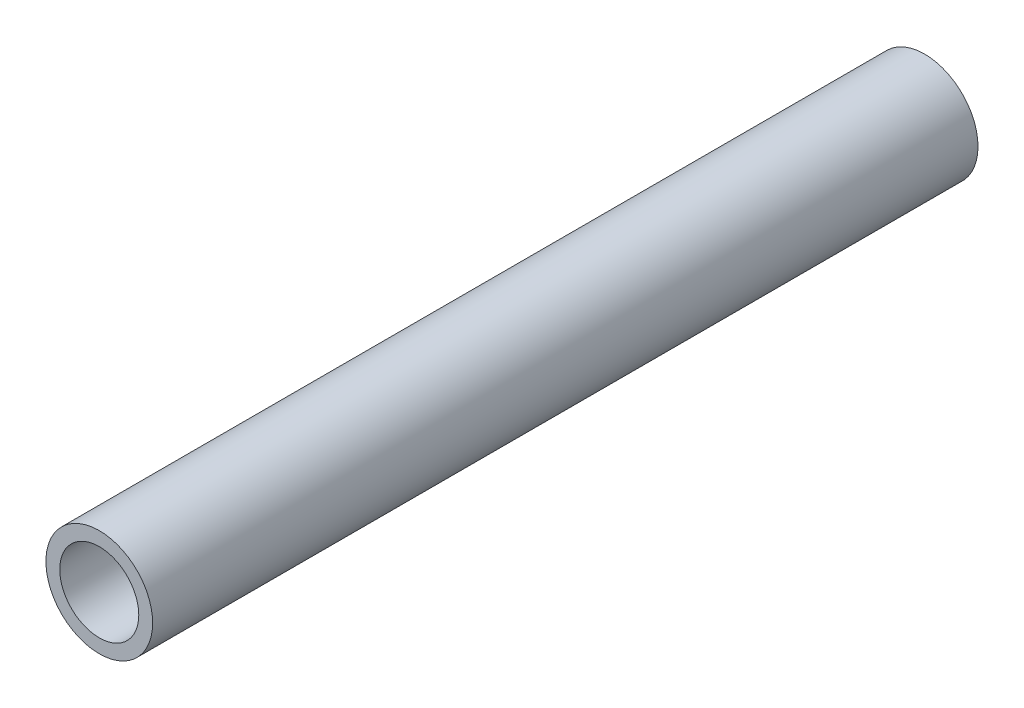
ISO-10303-21;
HEADER;
FILE_DESCRIPTION(('STEP AP214'),'2;1');
FILE_NAME('part.step','',(''),(''),'','','');
FILE_SCHEMA(('AUTOMOTIVE_DESIGN { 1 0 10303 214 1 1 1 1 }'));
ENDSEC;
DATA;
#1=APPLICATION_CONTEXT('core data for automotive mechanical design processes');
#2=APPLICATION_PROTOCOL_DEFINITION('international standard','automotive_design',2000,#1);
#3=PRODUCT_CONTEXT('',#1,'mechanical');
#4=PRODUCT('Part','Part','',(#3));
#5=PRODUCT_RELATED_PRODUCT_CATEGORY('part','',(#4));
#6=PRODUCT_DEFINITION_FORMATION('','',#4);
#7=PRODUCT_DEFINITION_CONTEXT('part definition',#1,'design');
#8=PRODUCT_DEFINITION('design','',#6,#7);
#9=PRODUCT_DEFINITION_SHAPE('','',#8);
#10=(LENGTH_UNIT() NAMED_UNIT(*) SI_UNIT(.MILLI.,.METRE.));
#11=(NAMED_UNIT(*) PLANE_ANGLE_UNIT() SI_UNIT($,.RADIAN.));
#12=(NAMED_UNIT(*) SI_UNIT($,.STERADIAN.) SOLID_ANGLE_UNIT());
#13=UNCERTAINTY_MEASURE_WITH_UNIT(LENGTH_MEASURE(1.E-05),#10,'distance_accuracy_value','');
#14=(GEOMETRIC_REPRESENTATION_CONTEXT(3) GLOBAL_UNCERTAINTY_ASSIGNED_CONTEXT((#13)) GLOBAL_UNIT_ASSIGNED_CONTEXT((#10,
#11,#12)) REPRESENTATION_CONTEXT('',''));
#15=CARTESIAN_POINT('',(0.,0.,0.));
#16=DIRECTION('',(0.,0.,1.));
#17=DIRECTION('',(1.,0.,0.));
#18=AXIS2_PLACEMENT_3D('',#15,#16,#17);
#19=CARTESIAN_POINT('',(0.,0.,82.5));
#20=DIRECTION('',(0.,0.,1.));
#21=DIRECTION('',(1.,0.,0.));
#22=AXIS2_PLACEMENT_3D('',#19,#20,#21);
#23=PLANE('',#22);
#24=CARTESIAN_POINT('',(0.,0.,82.5));
#25=DIRECTION('',(0.,0.,1.));
#26=DIRECTION('',(1.,0.,0.));
#27=AXIS2_PLACEMENT_3D('',#24,#25,#26);
#28=CIRCLE('',#27,10.668);
#29=CARTESIAN_POINT('',(10.668,0.,82.5));
#30=VERTEX_POINT('',#29);
#31=EDGE_CURVE('E11',#30,#30,#28,.T.);
#32=ORIENTED_EDGE('',*,*,#31,.T.);
#33=EDGE_LOOP('',(#32));
#34=FACE_BOUND('',#33,.T.);
#35=CARTESIAN_POINT('',(0.,0.,82.5));
#36=DIRECTION('',(0.,0.,1.));
#37=DIRECTION('',(1.,0.,0.));
#38=AXIS2_PLACEMENT_3D('',#35,#36,#37);
#39=CIRCLE('',#38,7.8994);
#40=CARTESIAN_POINT('',(7.8994,0.,82.5));
#41=VERTEX_POINT('',#40);
#42=EDGE_CURVE('E56',#41,#41,#39,.T.);
#43=ORIENTED_EDGE('',*,*,#42,.F.);
#44=EDGE_LOOP('',(#43));
#45=FACE_BOUND('',#44,.T.);
#46=ADVANCED_FACE('F43',(#34,#45),#23,.T.);
#47=CARTESIAN_POINT('',(0.,0.,-82.5));
#48=DIRECTION('',(0.,0.,1.));
#49=DIRECTION('',(1.,0.,0.));
#50=AXIS2_PLACEMENT_3D('',#47,#48,#49);
#51=PLANE('',#50);
#52=CARTESIAN_POINT('',(0.,0.,-82.5));
#53=DIRECTION('',(0.,0.,1.));
#54=DIRECTION('',(1.,0.,0.));
#55=AXIS2_PLACEMENT_3D('',#52,#53,#54);
#56=CIRCLE('',#55,10.668);
#57=CARTESIAN_POINT('',(10.668,0.,-82.5));
#58=VERTEX_POINT('',#57);
#59=EDGE_CURVE('E47',#58,#58,#56,.T.);
#60=ORIENTED_EDGE('',*,*,#59,.F.);
#61=EDGE_LOOP('',(#60));
#62=FACE_BOUND('',#61,.T.);
#63=CARTESIAN_POINT('',(0.,0.,-82.5));
#64=DIRECTION('',(0.,0.,1.));
#65=DIRECTION('',(1.,0.,0.));
#66=AXIS2_PLACEMENT_3D('',#63,#64,#65);
#67=CIRCLE('',#66,7.8994);
#68=CARTESIAN_POINT('',(7.8994,0.,-82.5));
#69=VERTEX_POINT('',#68);
#70=EDGE_CURVE('E58',#69,#69,#67,.T.);
#71=ORIENTED_EDGE('',*,*,#70,.T.);
#72=EDGE_LOOP('',(#71));
#73=FACE_BOUND('',#72,.T.);
#74=ADVANCED_FACE('F70',(#62,#73),#51,.F.);
#75=CARTESIAN_POINT('',(0.,0.,82.5));
#76=DIRECTION('',(0.,0.,-1.));
#77=DIRECTION('',(-1.,0.,0.));
#78=AXIS2_PLACEMENT_3D('',#75,#76,#77);
#79=CYLINDRICAL_SURFACE('',#78,10.668);
#80=ORIENTED_EDGE('',*,*,#31,.F.);
#81=EDGE_LOOP('',(#80));
#82=FACE_BOUND('',#81,.T.);
#83=ORIENTED_EDGE('',*,*,#59,.T.);
#84=EDGE_LOOP('',(#83));
#85=FACE_BOUND('',#84,.T.);
#86=ADVANCED_FACE('F45',(#82,#85),#79,.T.);
#87=CARTESIAN_POINT('',(0.,0.,82.5));
#88=DIRECTION('',(0.,0.,-1.));
#89=DIRECTION('',(-1.,0.,0.));
#90=AXIS2_PLACEMENT_3D('',#87,#88,#89);
#91=CYLINDRICAL_SURFACE('',#90,7.8994);
#92=ORIENTED_EDGE('',*,*,#42,.T.);
#93=EDGE_LOOP('',(#92));
#94=FACE_BOUND('',#93,.T.);
#95=ORIENTED_EDGE('',*,*,#70,.F.);
#96=EDGE_LOOP('',(#95));
#97=FACE_BOUND('',#96,.T.);
#98=ADVANCED_FACE('F66',(#94,#97),#91,.F.);
#99=CLOSED_SHELL('',(#46,#74,#86,#98));
#100=MANIFOLD_SOLID_BREP('B2',#99);
#101=ADVANCED_BREP_SHAPE_REPRESENTATION('',(#18,#100),#14);
#102=SHAPE_DEFINITION_REPRESENTATION(#9,#101);
ENDSEC;
END-ISO-10303-21;
